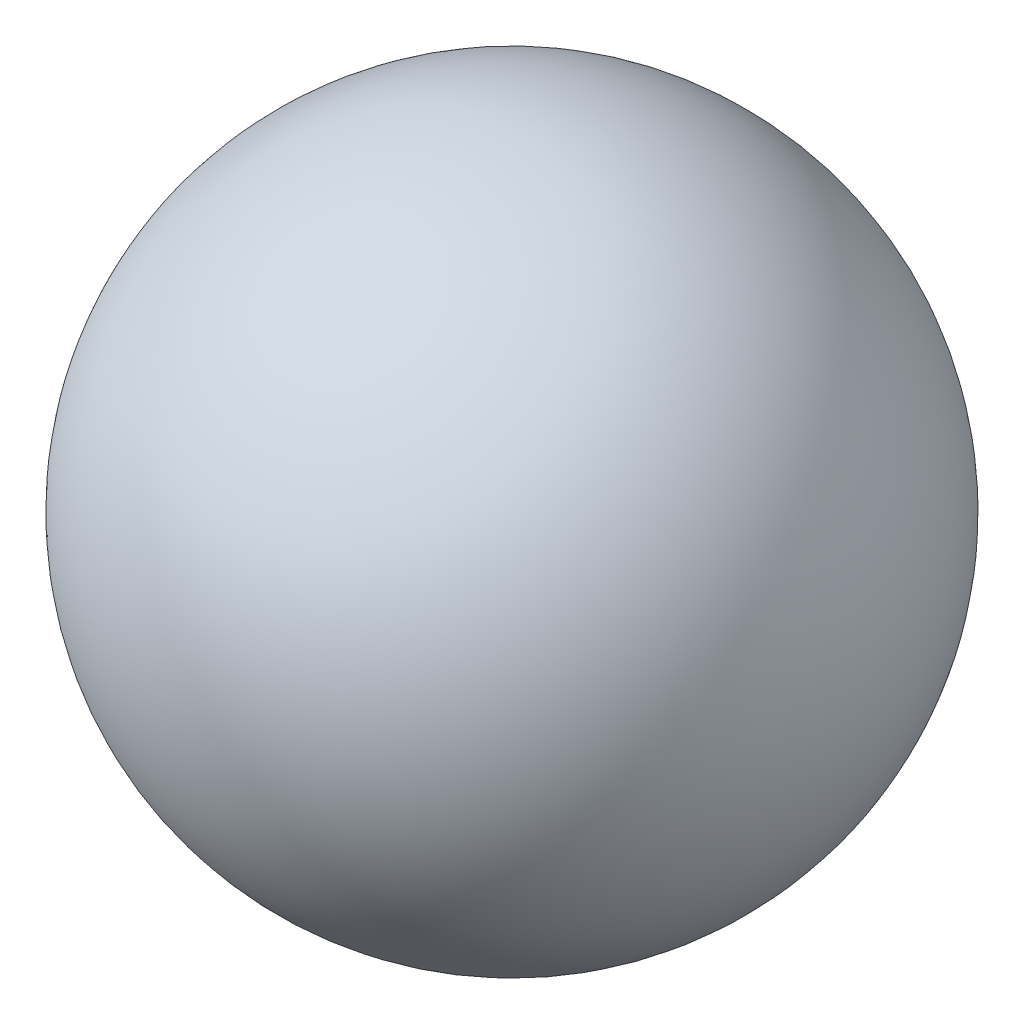
ISO-10303-21;
HEADER;
FILE_DESCRIPTION(('STEP AP214'),'2;1');
FILE_NAME('part.step','',(''),(''),'','','');
FILE_SCHEMA(('AUTOMOTIVE_DESIGN { 1 0 10303 214 1 1 1 1 }'));
ENDSEC;
DATA;
#1=APPLICATION_CONTEXT('core data for automotive mechanical design processes');
#2=APPLICATION_PROTOCOL_DEFINITION('international standard','automotive_design',2000,#1);
#3=PRODUCT_CONTEXT('',#1,'mechanical');
#4=PRODUCT('Part','Part','',(#3));
#5=PRODUCT_RELATED_PRODUCT_CATEGORY('part','',(#4));
#6=PRODUCT_DEFINITION_FORMATION('','',#4);
#7=PRODUCT_DEFINITION_CONTEXT('part definition',#1,'design');
#8=PRODUCT_DEFINITION('design','',#6,#7);
#9=PRODUCT_DEFINITION_SHAPE('','',#8);
#10=(LENGTH_UNIT() NAMED_UNIT(*) SI_UNIT(.MILLI.,.METRE.));
#11=(NAMED_UNIT(*) PLANE_ANGLE_UNIT() SI_UNIT($,.RADIAN.));
#12=(NAMED_UNIT(*) SI_UNIT($,.STERADIAN.) SOLID_ANGLE_UNIT());
#13=UNCERTAINTY_MEASURE_WITH_UNIT(LENGTH_MEASURE(1.E-05),#10,'distance_accuracy_value','');
#14=(GEOMETRIC_REPRESENTATION_CONTEXT(3) GLOBAL_UNCERTAINTY_ASSIGNED_CONTEXT((#13)) GLOBAL_UNIT_ASSIGNED_CONTEXT((#10,
#11,#12)) REPRESENTATION_CONTEXT('',''));
#15=CARTESIAN_POINT('',(0.,0.,0.));
#16=DIRECTION('',(0.,0.,1.));
#17=DIRECTION('',(1.,0.,0.));
#18=AXIS2_PLACEMENT_3D('',#15,#16,#17);
#19=CARTESIAN_POINT('',(-99.7377049180328,0.,0.));
#20=DIRECTION('',(-1.,0.,0.));
#21=DIRECTION('',(0.,1.,0.));
#22=AXIS2_PLACEMENT_3D('',#19,#20,#21);
#23=SPHERICAL_SURFACE('',#22,12.);
#24=CARTESIAN_POINT('',(-111.737704918033,0.,0.));
#25=VERTEX_POINT('',#24);
#26=VERTEX_LOOP('',#25);
#27=FACE_BOUND('',#26,.T.);
#28=ADVANCED_FACE('F33',(#27),#23,.T.);
#29=CLOSED_SHELL('',(#28));
#30=MANIFOLD_SOLID_BREP('B2',#29);
#31=ADVANCED_BREP_SHAPE_REPRESENTATION('',(#18,#30),#14);
#32=SHAPE_DEFINITION_REPRESENTATION(#9,#31);
ENDSEC;
END-ISO-10303-21;
